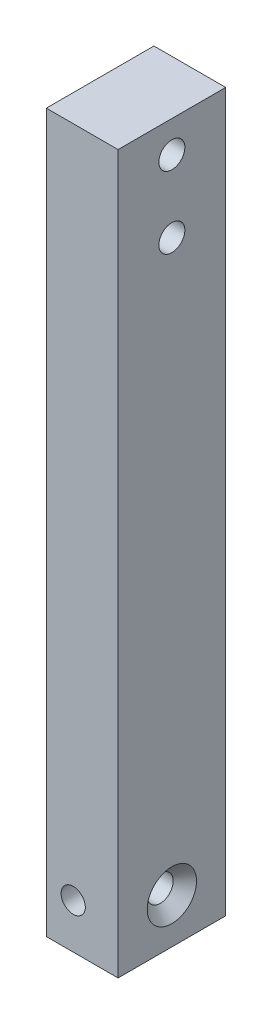
ISO-10303-21;
HEADER;
FILE_DESCRIPTION(('STEP AP214'),'2;1');
FILE_NAME('part.step','',(''),(''),'','','');
FILE_SCHEMA(('AUTOMOTIVE_DESIGN { 1 0 10303 214 1 1 1 1 }'));
ENDSEC;
DATA;
#1=APPLICATION_CONTEXT('core data for automotive mechanical design processes');
#2=APPLICATION_PROTOCOL_DEFINITION('international standard','automotive_design',2000,#1);
#3=PRODUCT_CONTEXT('',#1,'mechanical');
#4=PRODUCT('Part','Part','',(#3));
#5=PRODUCT_RELATED_PRODUCT_CATEGORY('part','',(#4));
#6=PRODUCT_DEFINITION_FORMATION('','',#4);
#7=PRODUCT_DEFINITION_CONTEXT('part definition',#1,'design');
#8=PRODUCT_DEFINITION('design','',#6,#7);
#9=PRODUCT_DEFINITION_SHAPE('','',#8);
#10=(LENGTH_UNIT() NAMED_UNIT(*) SI_UNIT(.MILLI.,.METRE.));
#11=(NAMED_UNIT(*) PLANE_ANGLE_UNIT() SI_UNIT($,.RADIAN.));
#12=(NAMED_UNIT(*) SI_UNIT($,.STERADIAN.) SOLID_ANGLE_UNIT());
#13=UNCERTAINTY_MEASURE_WITH_UNIT(LENGTH_MEASURE(1.E-05),#10,'distance_accuracy_value','');
#14=(GEOMETRIC_REPRESENTATION_CONTEXT(3) GLOBAL_UNCERTAINTY_ASSIGNED_CONTEXT((#13)) GLOBAL_UNIT_ASSIGNED_CONTEXT((#10,
#11,#12)) REPRESENTATION_CONTEXT('',''));
#15=CARTESIAN_POINT('',(0.,0.,0.));
#16=DIRECTION('',(0.,0.,1.));
#17=DIRECTION('',(1.,0.,0.));
#18=AXIS2_PLACEMENT_3D('',#15,#16,#17);
#19=CARTESIAN_POINT('',(8.,-40.,-6.));
#20=DIRECTION('',(0.,0.,1.));
#21=DIRECTION('',(1.,0.,0.));
#22=AXIS2_PLACEMENT_3D('',#19,#20,#21);
#23=PLANE('',#22);
#24=DIRECTION('',(0.,1.,0.));
#25=VECTOR('',#24,1.);
#26=CARTESIAN_POINT('',(0.,-40.,-6.));
#27=LINE('',#26,#25);
#28=CARTESIAN_POINT('',(0.,-40.,-6.));
#29=VERTEX_POINT('',#28);
#30=CARTESIAN_POINT('',(0.,40.,-6.));
#31=VERTEX_POINT('',#30);
#32=EDGE_CURVE('E102',#29,#31,#27,.T.);
#33=ORIENTED_EDGE('',*,*,#32,.T.);
#34=DIRECTION('',(-1.,0.,0.));
#35=VECTOR('',#34,1.);
#36=CARTESIAN_POINT('',(8.,40.,-6.));
#37=LINE('',#36,#35);
#38=CARTESIAN_POINT('',(8.,40.,-6.));
#39=VERTEX_POINT('',#38);
#40=EDGE_CURVE('E11',#39,#31,#37,.T.);
#41=ORIENTED_EDGE('',*,*,#40,.F.);
#42=DIRECTION('',(0.,1.,0.));
#43=VECTOR('',#42,1.);
#44=CARTESIAN_POINT('',(8.,-40.,-6.));
#45=LINE('',#44,#43);
#46=CARTESIAN_POINT('',(8.,-40.,-6.));
#47=VERTEX_POINT('',#46);
#48=EDGE_CURVE('E89',#47,#39,#45,.T.);
#49=ORIENTED_EDGE('',*,*,#48,.F.);
#50=DIRECTION('',(-1.,0.,0.));
#51=VECTOR('',#50,1.);
#52=CARTESIAN_POINT('',(8.,-40.,-6.));
#53=LINE('',#52,#51);
#54=EDGE_CURVE('E98',#47,#29,#53,.T.);
#55=ORIENTED_EDGE('',*,*,#54,.T.);
#56=EDGE_LOOP('',(#33,#41,#49,#55));
#57=FACE_BOUND('',#56,.T.);
#58=CARTESIAN_POINT('',(3.,-35.,-6.));
#59=DIRECTION('',(0.,0.,-1.));
#60=DIRECTION('',(-1.,0.,0.));
#61=AXIS2_PLACEMENT_3D('',#58,#59,#60);
#62=CIRCLE('',#61,1.35);
#63=CARTESIAN_POINT('',(1.65,-35.,-6.));
#64=VERTEX_POINT('',#63);
#65=EDGE_CURVE('E174',#64,#64,#62,.T.);
#66=ORIENTED_EDGE('',*,*,#65,.F.);
#67=EDGE_LOOP('',(#66));
#68=FACE_BOUND('',#67,.T.);
#69=ADVANCED_FACE('F37',(#57,#68),#23,.F.);
#70=CARTESIAN_POINT('',(8.,40.,6.));
#71=DIRECTION('',(0.,-1.,0.));
#72=DIRECTION('',(0.,0.,-1.));
#73=AXIS2_PLACEMENT_3D('',#70,#71,#72);
#74=PLANE('',#73);
#75=DIRECTION('',(0.,0.,1.));
#76=VECTOR('',#75,1.);
#77=CARTESIAN_POINT('',(0.,40.,6.));
#78=LINE('',#77,#76);
#79=CARTESIAN_POINT('',(0.,40.,6.));
#80=VERTEX_POINT('',#79);
#81=EDGE_CURVE('E93',#31,#80,#78,.T.);
#82=ORIENTED_EDGE('',*,*,#81,.T.);
#83=DIRECTION('',(-1.,0.,0.));
#84=VECTOR('',#83,1.);
#85=CARTESIAN_POINT('',(8.,40.,6.));
#86=LINE('',#85,#84);
#87=CARTESIAN_POINT('',(8.,40.,6.));
#88=VERTEX_POINT('',#87);
#89=EDGE_CURVE('E46',#88,#80,#86,.T.);
#90=ORIENTED_EDGE('',*,*,#89,.F.);
#91=DIRECTION('',(0.,0.,1.));
#92=VECTOR('',#91,1.);
#93=CARTESIAN_POINT('',(8.,40.,6.));
#94=LINE('',#93,#92);
#95=EDGE_CURVE('E84',#39,#88,#94,.T.);
#96=ORIENTED_EDGE('',*,*,#95,.F.);
#97=ORIENTED_EDGE('',*,*,#40,.T.);
#98=EDGE_LOOP('',(#82,#90,#96,#97));
#99=FACE_BOUND('',#98,.T.);
#100=ADVANCED_FACE('F92',(#99),#74,.F.);
#101=CARTESIAN_POINT('',(8.,-40.,6.));
#102=DIRECTION('',(0.,0.,-1.));
#103=DIRECTION('',(-1.,0.,0.));
#104=AXIS2_PLACEMENT_3D('',#101,#102,#103);
#105=PLANE('',#104);
#106=CARTESIAN_POINT('',(3.,-35.,6.));
#107=DIRECTION('',(0.,0.,1.));
#108=DIRECTION('',(1.,0.,0.));
#109=AXIS2_PLACEMENT_3D('',#106,#107,#108);
#110=CIRCLE('',#109,1.35);
#111=CARTESIAN_POINT('',(4.35,-35.,6.));
#112=VERTEX_POINT('',#111);
#113=EDGE_CURVE('E153',#112,#112,#110,.T.);
#114=ORIENTED_EDGE('',*,*,#113,.F.);
#115=EDGE_LOOP('',(#114));
#116=FACE_BOUND('',#115,.T.);
#117=DIRECTION('',(0.,-1.,0.));
#118=VECTOR('',#117,1.);
#119=CARTESIAN_POINT('',(0.,-40.,6.));
#120=LINE('',#119,#118);
#121=CARTESIAN_POINT('',(0.,-40.,6.));
#122=VERTEX_POINT('',#121);
#123=EDGE_CURVE('E71',#80,#122,#120,.T.);
#124=ORIENTED_EDGE('',*,*,#123,.T.);
#125=DIRECTION('',(-1.,0.,0.));
#126=VECTOR('',#125,1.);
#127=CARTESIAN_POINT('',(8.,-40.,6.));
#128=LINE('',#127,#126);
#129=CARTESIAN_POINT('',(8.,-40.,6.));
#130=VERTEX_POINT('',#129);
#131=EDGE_CURVE('E94',#130,#122,#128,.T.);
#132=ORIENTED_EDGE('',*,*,#131,.F.);
#133=DIRECTION('',(0.,-1.,0.));
#134=VECTOR('',#133,1.);
#135=CARTESIAN_POINT('',(8.,-40.,6.));
#136=LINE('',#135,#134);
#137=EDGE_CURVE('E87',#88,#130,#136,.T.);
#138=ORIENTED_EDGE('',*,*,#137,.F.);
#139=ORIENTED_EDGE('',*,*,#89,.T.);
#140=EDGE_LOOP('',(#124,#132,#138,#139));
#141=FACE_BOUND('',#140,.T.);
#142=ADVANCED_FACE('F96',(#116,#141),#105,.F.);
#143=CARTESIAN_POINT('',(8.,-40.,6.));
#144=DIRECTION('',(0.,1.,0.));
#145=DIRECTION('',(0.,0.,1.));
#146=AXIS2_PLACEMENT_3D('',#143,#144,#145);
#147=PLANE('',#146);
#148=DIRECTION('',(0.,0.,-1.));
#149=VECTOR('',#148,1.);
#150=CARTESIAN_POINT('',(0.,-40.,6.));
#151=LINE('',#150,#149);
#152=EDGE_CURVE('E77',#122,#29,#151,.T.);
#153=ORIENTED_EDGE('',*,*,#152,.T.);
#154=ORIENTED_EDGE('',*,*,#54,.F.);
#155=DIRECTION('',(0.,0.,-1.));
#156=VECTOR('',#155,1.);
#157=CARTESIAN_POINT('',(8.,-40.,6.));
#158=LINE('',#157,#156);
#159=EDGE_CURVE('E54',#130,#47,#158,.T.);
#160=ORIENTED_EDGE('',*,*,#159,.F.);
#161=ORIENTED_EDGE('',*,*,#131,.T.);
#162=EDGE_LOOP('',(#153,#154,#160,#161));
#163=FACE_BOUND('',#162,.T.);
#164=ADVANCED_FACE('F110',(#163),#147,.F.);
#165=CARTESIAN_POINT('',(8.,0.,0.));
#166=DIRECTION('',(-1.,0.,0.));
#167=DIRECTION('',(0.,0.,1.));
#168=AXIS2_PLACEMENT_3D('',#165,#166,#167);
#169=PLANE('',#168);
#170=CARTESIAN_POINT('',(8.,36.5,0.));
#171=DIRECTION('',(-1.,0.,0.));
#172=DIRECTION('',(0.,0.,1.));
#173=AXIS2_PLACEMENT_3D('',#170,#171,#172);
#174=CIRCLE('',#173,1.45);
#175=CARTESIAN_POINT('',(8.,36.5,1.45));
#176=VERTEX_POINT('',#175);
#177=EDGE_CURVE('E137',#176,#176,#174,.T.);
#178=ORIENTED_EDGE('',*,*,#177,.T.);
#179=EDGE_LOOP('',(#178));
#180=FACE_BOUND('',#179,.T.);
#181=CARTESIAN_POINT('',(8.,28.5,0.));
#182=DIRECTION('',(-1.,0.,0.));
#183=DIRECTION('',(0.,0.,1.));
#184=AXIS2_PLACEMENT_3D('',#181,#182,#183);
#185=CIRCLE('',#184,1.45);
#186=CARTESIAN_POINT('',(8.,28.5,1.45));
#187=VERTEX_POINT('',#186);
#188=EDGE_CURVE('E128',#187,#187,#185,.T.);
#189=ORIENTED_EDGE('',*,*,#188,.T.);
#190=EDGE_LOOP('',(#189));
#191=FACE_BOUND('',#190,.T.);
#192=CARTESIAN_POINT('',(8.,-35.,0.));
#193=DIRECTION('',(1.,0.,0.));
#194=DIRECTION('',(0.,0.,-1.));
#195=AXIS2_PLACEMENT_3D('',#192,#193,#194);
#196=CIRCLE('',#195,2.75);
#197=CARTESIAN_POINT('',(8.,-35.,-2.75));
#198=VERTEX_POINT('',#197);
#199=EDGE_CURVE('E125',#198,#198,#196,.T.);
#200=ORIENTED_EDGE('',*,*,#199,.F.);
#201=EDGE_LOOP('',(#200));
#202=FACE_BOUND('',#201,.T.);
#203=ORIENTED_EDGE('',*,*,#48,.T.);
#204=ORIENTED_EDGE('',*,*,#95,.T.);
#205=ORIENTED_EDGE('',*,*,#137,.T.);
#206=ORIENTED_EDGE('',*,*,#159,.T.);
#207=EDGE_LOOP('',(#203,#204,#205,#206));
#208=FACE_BOUND('',#207,.T.);
#209=ADVANCED_FACE('F85',(#180,#191,#202,#208),#169,.F.);
#210=CARTESIAN_POINT('',(0.,0.,0.));
#211=DIRECTION('',(-1.,0.,0.));
#212=DIRECTION('',(0.,0.,1.));
#213=AXIS2_PLACEMENT_3D('',#210,#211,#212);
#214=PLANE('',#213);
#215=CARTESIAN_POINT('',(0.,36.5,0.));
#216=DIRECTION('',(-1.,0.,0.));
#217=DIRECTION('',(0.,0.,1.));
#218=AXIS2_PLACEMENT_3D('',#215,#216,#217);
#219=CIRCLE('',#218,2.75);
#220=CARTESIAN_POINT('',(0.,36.5,2.75));
#221=VERTEX_POINT('',#220);
#222=EDGE_CURVE('E143',#221,#221,#219,.T.);
#223=ORIENTED_EDGE('',*,*,#222,.F.);
#224=EDGE_LOOP('',(#223));
#225=FACE_BOUND('',#224,.T.);
#226=CARTESIAN_POINT('',(0.,28.5,0.));
#227=DIRECTION('',(-1.,0.,0.));
#228=DIRECTION('',(0.,0.,1.));
#229=AXIS2_PLACEMENT_3D('',#226,#227,#228);
#230=CIRCLE('',#229,2.75);
#231=CARTESIAN_POINT('',(0.,28.5,2.75));
#232=VERTEX_POINT('',#231);
#233=EDGE_CURVE('E134',#232,#232,#230,.T.);
#234=ORIENTED_EDGE('',*,*,#233,.F.);
#235=EDGE_LOOP('',(#234));
#236=FACE_BOUND('',#235,.T.);
#237=CARTESIAN_POINT('',(0.,-35.,0.));
#238=DIRECTION('',(-1.,0.,0.));
#239=DIRECTION('',(0.,0.,1.));
#240=AXIS2_PLACEMENT_3D('',#237,#238,#239);
#241=CIRCLE('',#240,3.);
#242=CARTESIAN_POINT('',(0.,-35.,3.));
#243=VERTEX_POINT('',#242);
#244=EDGE_CURVE('E117',#243,#243,#241,.T.);
#245=ORIENTED_EDGE('',*,*,#244,.F.);
#246=EDGE_LOOP('',(#245));
#247=FACE_BOUND('',#246,.T.);
#248=ORIENTED_EDGE('',*,*,#32,.F.);
#249=ORIENTED_EDGE('',*,*,#152,.F.);
#250=ORIENTED_EDGE('',*,*,#123,.F.);
#251=ORIENTED_EDGE('',*,*,#81,.F.);
#252=EDGE_LOOP('',(#248,#249,#250,#251));
#253=FACE_BOUND('',#252,.T.);
#254=ADVANCED_FACE('F113',(#225,#236,#247,#253),#214,.T.);
#255=CARTESIAN_POINT('',(5.,-35.,0.));
#256=DIRECTION('',(-1.,0.,0.));
#257=DIRECTION('',(0.,0.,1.));
#258=AXIS2_PLACEMENT_3D('',#255,#256,#257);
#259=CYLINDRICAL_SURFACE('',#258,3.);
#260=CARTESIAN_POINT('',(1.65,-35.,-3.));
#261=CARTESIAN_POINT('',(1.65000350950048,-35.0717942983233,-2.99999710819746));
#262=CARTESIAN_POINT('',(1.6557608673864,-35.1436983257465,-2.99739409084056));
#263=CARTESIAN_POINT('',(1.67855970174929,-35.2854324900246,-2.98724013750941));
#264=CARTESIAN_POINT('',(1.69562778351864,-35.3552573305551,-2.97967753594657));
#265=CARTESIAN_POINT('',(1.74027495751617,-35.4905590338216,-2.96040619544781));
#266=CARTESIAN_POINT('',(1.76781618593373,-35.5560505730756,-2.94871240278778));
#267=CARTESIAN_POINT('',(1.83245621750942,-35.6814095112711,-2.92229198635354));
#268=CARTESIAN_POINT('',(1.86955298622526,-35.74127810368,-2.90756600828684));
#269=CARTESIAN_POINT('',(1.9544578498576,-35.8571850017538,-2.87559272931306));
#270=CARTESIAN_POINT('',(2.002721084672,-35.9128645010314,-2.85825436147132));
#271=CARTESIAN_POINT('',(2.10762143877568,-36.0156568565076,-2.8233655994703));
#272=CARTESIAN_POINT('',(2.16426363743658,-36.0627644774873,-2.80581508267312));
#273=CARTESIAN_POINT('',(2.28838727675673,-36.1498651080576,-2.77130585686826));
#274=CARTESIAN_POINT('',(2.35631334295036,-36.1892673477779,-2.75444463646883));
#275=CARTESIAN_POINT('',(2.4986888749684,-36.2559279592838,-2.72469944797672));
#276=CARTESIAN_POINT('',(2.57313441083328,-36.283193587576,-2.71181310471531));
#277=CARTESIAN_POINT('',(2.72231593088279,-36.3232653242064,-2.69247896324617));
#278=CARTESIAN_POINT('',(2.79682369484703,-36.3367664156076,-2.68572383239535));
#279=CARTESIAN_POINT('',(2.94732924033773,-36.3510844529698,-2.67855223230496));
#280=CARTESIAN_POINT('',(3.0233259509632,-36.3519102027218,-2.67813136354141));
#281=CARTESIAN_POINT('',(3.16714916508567,-36.3413714850933,-2.6834202803121));
#282=CARTESIAN_POINT('',(3.23508267403706,-36.3311244545175,-2.68856813661516));
#283=CARTESIAN_POINT('',(3.36813718586633,-36.3006289156747,-2.7034513561071));
#284=CARTESIAN_POINT('',(3.4332575316965,-36.2803780844885,-2.71318778475506));
#285=CARTESIAN_POINT('',(3.56060319923034,-36.2300488379592,-2.73637704262371));
#286=CARTESIAN_POINT('',(3.62272965899791,-36.1997583977564,-2.74990898685239));
#287=CARTESIAN_POINT('',(3.7412844568565,-36.1303629500304,-2.77915372781559));
#288=CARTESIAN_POINT('',(3.79771035541585,-36.0912541916881,-2.79486745146097));
#289=CARTESIAN_POINT('',(3.90921040456463,-36.0007467888471,-2.82861476581816));
#290=CARTESIAN_POINT('',(3.96358342883758,-35.9485096459322,-2.84672309557187));
#291=CARTESIAN_POINT('',(4.06305500229032,-35.8355129633098,-2.88191228554332));
#292=CARTESIAN_POINT('',(4.10815060725115,-35.774750728395,-2.89899281837343));
#293=CARTESIAN_POINT('',(4.18905826521189,-35.6439940036119,-2.9308585664278));
#294=CARTESIAN_POINT('',(4.22453943934769,-35.5737718186378,-2.94555628131278));
#295=CARTESIAN_POINT('',(4.28293078287295,-35.427523890627,-2.9703043427381));
#296=CARTESIAN_POINT('',(4.30584907824224,-35.351501935367,-2.98035769270489));
#297=CARTESIAN_POINT('',(4.33689120397102,-35.2016305566774,-2.99409415860333));
#298=CARTESIAN_POINT('',(4.34595306619363,-35.1280124752407,-2.99818023391338));
#299=CARTESIAN_POINT('',(4.35187762426023,-34.9801982870243,-3.00084388971438));
#300=CARTESIAN_POINT('',(4.34874460445536,-34.9060023923851,-2.99942340479119));
#301=CARTESIAN_POINT('',(4.33099648303478,-34.7638361617384,-2.99148733912252));
#302=CARTESIAN_POINT('',(4.31708032703026,-34.6957591141238,-2.98528201918371));
#303=CARTESIAN_POINT('',(4.2791801221918,-34.5630042972543,-2.96875596530774));
#304=CARTESIAN_POINT('',(4.25519486073181,-34.498326938481,-2.95843473569758));
#305=CARTESIAN_POINT('',(4.19708127230387,-34.371918029331,-2.93424357362228));
#306=CARTESIAN_POINT('',(4.16266054545513,-34.3103407704961,-2.92027320912254));
#307=CARTESIAN_POINT('',(4.08497169467193,-34.1936146722566,-2.89022166549104));
#308=CARTESIAN_POINT('',(4.04169970073611,-34.1384686613751,-2.87413956415872));
#309=CARTESIAN_POINT('',(3.9433857999954,-34.0313760119846,-2.83992652839844));
#310=CARTESIAN_POINT('',(3.88766779977351,-33.9800675863835,-2.82173597139228));
#311=CARTESIAN_POINT('',(3.7682036616592,-33.8873073399625,-2.7864643019524));
#312=CARTESIAN_POINT('',(3.70445445882444,-33.84585929969,-2.76938361687061));
#313=CARTESIAN_POINT('',(3.56855280366971,-33.7730787365895,-2.73793380812811));
#314=CARTESIAN_POINT('',(3.49622705097992,-33.7420322293053,-2.72364526364248));
#315=CARTESIAN_POINT('',(3.34652017216282,-33.6928601422859,-2.70039592602716));
#316=CARTESIAN_POINT('',(3.26914424141069,-33.6747215053532,-2.69142975048318));
#317=CARTESIAN_POINT('',(3.11871155273221,-33.653272826041,-2.68075667169167));
#318=CARTESIAN_POINT('',(3.04585733377422,-33.6488194478458,-2.6784906959906));
#319=CARTESIAN_POINT('',(2.90045361080538,-33.6517144036473,-2.67994960996189));
#320=CARTESIAN_POINT('',(2.82790404104926,-33.6590600445854,-2.68367313256576));
#321=CARTESIAN_POINT('',(2.68993930670592,-33.6843359276107,-2.69614629806841));
#322=CARTESIAN_POINT('',(2.62436300219797,-33.7015680292289,-2.70456348750257));
#323=CARTESIAN_POINT('',(2.49704581857155,-33.7453793779933,-2.7251623303891));
#324=CARTESIAN_POINT('',(2.43530606168956,-33.7719613450848,-2.73734507914543));
#325=CARTESIAN_POINT('',(2.31303445083683,-33.8356826269182,-2.7650759189415));
#326=CARTESIAN_POINT('',(2.25283933099918,-33.8733938317262,-2.78079077572679));
#327=CARTESIAN_POINT('',(2.13927723198342,-33.9575716235044,-2.81342848547022));
#328=CARTESIAN_POINT('',(2.08591321078676,-34.0040419819468,-2.83035185682753));
#329=CARTESIAN_POINT('',(1.98253042634256,-34.1093922141672,-2.86533877617132));
#330=CARTESIAN_POINT('',(1.93325276629208,-34.1690149420683,-2.88336671225994));
#331=CARTESIAN_POINT('',(1.84531523408091,-34.2963059813491,-2.91704362931292));
#332=CARTESIAN_POINT('',(1.80666024541196,-34.3639779727494,-2.93269151464089));
#333=CARTESIAN_POINT('',(1.74166835741715,-34.5049570709397,-2.95973519982059));
#334=CARTESIAN_POINT('',(1.71521243882989,-34.5782012385757,-2.97117185469687));
#335=CARTESIAN_POINT('',(1.67528215179476,-34.728630894621,-2.98865352259014));
#336=CARTESIAN_POINT('',(1.66176841341891,-34.8058036730128,-2.99471488298502));
#337=CARTESIAN_POINT('',(1.65335528527319,-34.902898747277,-2.99849167271413));
#338=CARTESIAN_POINT('',(1.65209827142417,-34.9222909880002,-2.99905628756061));
#339=CARTESIAN_POINT('',(1.6504201478228,-34.9611194691812,-2.99981084536562));
#340=CARTESIAN_POINT('',(1.64999904951026,-34.9805557102375,-3.00000078319655));
#341=CARTESIAN_POINT('',(1.65,-35.,-3.));
#342=B_SPLINE_CURVE_WITH_KNOTS('',3,(#260,#261,#262,#263,#264,#265,#266,#267,#268,#269,#270,
#271,#272,#273,#274,#275,#276,#277,#278,#279,#280,#281,#282,#283,#284,#285,#286,#287,#288,#289,
#290,#291,#292,#293,#294,#295,#296,#297,#298,#299,#300,#301,#302,#303,#304,#305,#306,#307,#308,
#309,#310,#311,#312,#313,#314,#315,#316,#317,#318,#319,#320,#321,#322,#323,#324,#325,#326,#327,
#328,#329,#330,#331,#332,#333,#334,#335,#336,#337,#338,#339,#340,#341),.UNSPECIFIED.,.T.,.F.,(4,
2,2,2,2,2,2,2,2,2,2,2,2,2,2,2,2,2,2,2,2,2,2,2,2,2,2,2,2,2,2,2,2,2,2,2,2,2,2,2,4),(0.,
0.215303084427217,0.431114414931766,0.646152823408292,0.86114548647053,1.08726953424048,
1.31353122563331,1.55326754039452,1.79286032311304,2.01964651955436,2.24627519213992,
2.45199894249931,2.65777048513474,2.86819857827373,3.07871634515167,3.31031406768875,
3.54198517551711,3.78083332859653,4.0195268059487,4.24120773308937,4.46281078549604,
4.67114116806695,4.87949664714234,5.09433557821699,5.30926864394808,5.54191493070125,
5.77465027258589,6.01334164055913,6.25179121126565,6.46968869048817,6.68753644292214,
6.8916189909066,7.09576095718724,7.3131138968391,7.53056063789665,7.76770791551891,
8.00496403362731,8.23985367573744,8.47402649574548,8.5323369516829,8.59064820561441),.UNSPECIFIED.);
#343=CARTESIAN_POINT('',(1.65,-35.,-3.));
#344=VERTEX_POINT('',#343);
#345=EDGE_CURVE('E170',#344,#344,#342,.T.);
#346=ORIENTED_EDGE('',*,*,#345,.F.);
#347=EDGE_LOOP('',(#346));
#348=FACE_BOUND('',#347,.T.);
#349=CARTESIAN_POINT('',(4.35,-35.,3.));
#350=CARTESIAN_POINT('',(4.34999649049952,-34.9282057016768,2.99999710819746));
#351=CARTESIAN_POINT('',(4.3442391326136,-34.8563016742536,2.99739409084056));
#352=CARTESIAN_POINT('',(4.3214402982507,-34.7145675099754,2.98724013750941));
#353=CARTESIAN_POINT('',(4.30437221648136,-34.6447426694449,2.97967753594657));
#354=CARTESIAN_POINT('',(4.25972504248383,-34.5094409661784,2.96040619544782));
#355=CARTESIAN_POINT('',(4.23218381406627,-34.4439494269245,2.94871240278778));
#356=CARTESIAN_POINT('',(4.16754378249057,-34.3185904887289,2.92229198635354));
#357=CARTESIAN_POINT('',(4.13044701377473,-34.2587218963201,2.90756600828684));
#358=CARTESIAN_POINT('',(4.04554215014239,-34.1428149982462,2.87559272931306));
#359=CARTESIAN_POINT('',(3.99727891532799,-34.0871354989686,2.85825436147132));
#360=CARTESIAN_POINT('',(3.89237856122431,-33.9843431434924,2.8233655994703));
#361=CARTESIAN_POINT('',(3.83573636256342,-33.9372355225128,2.80581508267313));
#362=CARTESIAN_POINT('',(3.71161272324326,-33.8501348919425,2.77130585686827));
#363=CARTESIAN_POINT('',(3.64368665704964,-33.8107326522221,2.75444463646883));
#364=CARTESIAN_POINT('',(3.50131112503159,-33.7440720407162,2.72469944797673));
#365=CARTESIAN_POINT('',(3.42686558916672,-33.716806412424,2.71181310471532));
#366=CARTESIAN_POINT('',(3.2776840691172,-33.6767346757936,2.69247896324618));
#367=CARTESIAN_POINT('',(3.20317630515297,-33.6632335843924,2.68572383239536));
#368=CARTESIAN_POINT('',(3.05267075966227,-33.6489155470303,2.67855223230496));
#369=CARTESIAN_POINT('',(2.9766740490368,-33.6480897972783,2.67813136354142));
#370=CARTESIAN_POINT('',(2.83285083491432,-33.6586285149067,2.68342028031211));
#371=CARTESIAN_POINT('',(2.76491732596293,-33.6688755454825,2.68856813661517));
#372=CARTESIAN_POINT('',(2.63186281413367,-33.6993710843254,2.70345135610711));
#373=CARTESIAN_POINT('',(2.56674246830349,-33.7196219155115,2.71318778475507));
#374=CARTESIAN_POINT('',(2.43939680076965,-33.7699511620408,2.73637704262371));
#375=CARTESIAN_POINT('',(2.37727034100209,-33.8002416022436,2.7499089868524));
#376=CARTESIAN_POINT('',(2.25871554314349,-33.8696370499697,2.7791537278156));
#377=CARTESIAN_POINT('',(2.20228964458414,-33.9087458083119,2.79486745146098));
#378=CARTESIAN_POINT('',(2.09078959543536,-33.9992532111529,2.82861476581816));
#379=CARTESIAN_POINT('',(2.03641657116241,-34.0514903540679,2.84672309557188));
#380=CARTESIAN_POINT('',(1.93694499770968,-34.1644870366902,2.88191228554333));
#381=CARTESIAN_POINT('',(1.89184939274885,-34.225249271605,2.89899281837343));
#382=CARTESIAN_POINT('',(1.81094173478811,-34.3560059963881,2.93085856642781));
#383=CARTESIAN_POINT('',(1.7754605606523,-34.4262281813622,2.94555628131279));
#384=CARTESIAN_POINT('',(1.71706921712705,-34.572476109373,2.97030434273811));
#385=CARTESIAN_POINT('',(1.69415092175776,-34.648498064633,2.98035769270489));
#386=CARTESIAN_POINT('',(1.66310879602898,-34.7983694433227,2.99409415860334));
#387=CARTESIAN_POINT('',(1.65404693380637,-34.8719875247594,2.99818023391339));
#388=CARTESIAN_POINT('',(1.64812237573977,-35.0198017129758,3.00084388971438));
#389=CARTESIAN_POINT('',(1.65125539554464,-35.0939976076149,2.99942340479119));
#390=CARTESIAN_POINT('',(1.66900351696522,-35.2361638382616,2.99148733912252));
#391=CARTESIAN_POINT('',(1.68291967296974,-35.3042408858762,2.98528201918371));
#392=CARTESIAN_POINT('',(1.7208198778082,-35.4369957027458,2.96875596530774));
#393=CARTESIAN_POINT('',(1.74480513926819,-35.501673061519,2.95843473569757));
#394=CARTESIAN_POINT('',(1.80291872769613,-35.628081970669,2.93424357362228));
#395=CARTESIAN_POINT('',(1.83733945454487,-35.6896592295039,2.92027320912254));
#396=CARTESIAN_POINT('',(1.91502830532807,-35.8063853277435,2.89022166549104));
#397=CARTESIAN_POINT('',(1.95830029926389,-35.861531338625,2.87413956415871));
#398=CARTESIAN_POINT('',(2.05661420000461,-35.9686239880154,2.83992652839843));
#399=CARTESIAN_POINT('',(2.11233220022649,-36.0199324136165,2.82173597139227));
#400=CARTESIAN_POINT('',(2.23179633834081,-36.1126926600375,2.78646430195239));
#401=CARTESIAN_POINT('',(2.29554554117557,-36.15414070031,2.7693836168706));
#402=CARTESIAN_POINT('',(2.4314471963303,-36.2269212634106,2.7379338081281));
#403=CARTESIAN_POINT('',(2.50377294902009,-36.2579677706947,2.72364526364247));
#404=CARTESIAN_POINT('',(2.65347982783719,-36.3071398577141,2.70039592602715));
#405=CARTESIAN_POINT('',(2.73085575858932,-36.3252784946468,2.69142975048318));
#406=CARTESIAN_POINT('',(2.8812884472678,-36.346727173959,2.68075667169167));
#407=CARTESIAN_POINT('',(2.95414266622579,-36.3511805521543,2.67849069599059));
#408=CARTESIAN_POINT('',(3.09954638919463,-36.3482855963527,2.67994960996188));
#409=CARTESIAN_POINT('',(3.17209595895075,-36.3409399554146,2.68367313256576));
#410=CARTESIAN_POINT('',(3.31006069329408,-36.3156640723893,2.6961462980684));
#411=CARTESIAN_POINT('',(3.37563699780203,-36.2984319707712,2.70456348750257));
#412=CARTESIAN_POINT('',(3.50295418142846,-36.2546206220068,2.72516233038909));
#413=CARTESIAN_POINT('',(3.56469393831045,-36.2280386549153,2.73734507914542));
#414=CARTESIAN_POINT('',(3.68696554916317,-36.1643173730818,2.76507591894149));
#415=CARTESIAN_POINT('',(3.74716066900083,-36.1266061682739,2.78079077572678));
#416=CARTESIAN_POINT('',(3.86072276801659,-36.0424283764956,2.81342848547021));
#417=CARTESIAN_POINT('',(3.91408678921325,-35.9959580180532,2.83035185682753));
#418=CARTESIAN_POINT('',(4.01746957365745,-35.8906077858328,2.86533877617131));
#419=CARTESIAN_POINT('',(4.06674723370793,-35.8309850579317,2.88336671225994));
#420=CARTESIAN_POINT('',(4.15468476591909,-35.7036940186509,2.91704362931292));
#421=CARTESIAN_POINT('',(4.19333975458804,-35.6360220272506,2.93269151464089));
#422=CARTESIAN_POINT('',(4.25833164258285,-35.4950429290604,2.95973519982059));
#423=CARTESIAN_POINT('',(4.28478756117011,-35.4217987614243,2.97117185469687));
#424=CARTESIAN_POINT('',(4.32471784820524,-35.271369105379,2.98865352259014));
#425=CARTESIAN_POINT('',(4.33823158658109,-35.1941963269872,2.99471488298502));
#426=CARTESIAN_POINT('',(4.34664471472681,-35.097101252723,2.99849167271413));
#427=CARTESIAN_POINT('',(4.34790172857583,-35.0777090119998,2.99905628756061));
#428=CARTESIAN_POINT('',(4.3495798521772,-35.0388805308188,2.99981084536562));
#429=CARTESIAN_POINT('',(4.35000095048974,-35.0194442897625,3.00000078319655));
#430=CARTESIAN_POINT('',(4.35,-35.,3.));
#431=B_SPLINE_CURVE_WITH_KNOTS('',3,(#349,#350,#351,#352,#353,#354,#355,#356,#357,#358,#359,
#360,#361,#362,#363,#364,#365,#366,#367,#368,#369,#370,#371,#372,#373,#374,#375,#376,#377,#378,
#379,#380,#381,#382,#383,#384,#385,#386,#387,#388,#389,#390,#391,#392,#393,#394,#395,#396,#397,
#398,#399,#400,#401,#402,#403,#404,#405,#406,#407,#408,#409,#410,#411,#412,#413,#414,#415,#416,
#417,#418,#419,#420,#421,#422,#423,#424,#425,#426,#427,#428,#429,#430),.UNSPECIFIED.,.T.,.F.,(4,
2,2,2,2,2,2,2,2,2,2,2,2,2,2,2,2,2,2,2,2,2,2,2,2,2,2,2,2,2,2,2,2,2,2,2,2,2,2,2,4),(0.,
0.215303084427217,0.431114414931766,0.646152823408293,0.861145486470532,1.08726953424048,
1.31353122563331,1.55326754039452,1.79286032311303,2.01964651955436,2.24627519213992,
2.45199894249931,2.65777048513474,2.86819857827373,3.07871634515167,3.31031406768874,
3.54198517551711,3.78083332859654,4.01952680594871,4.24120773308938,4.46281078549604,
4.67114116806694,4.87949664714234,5.09433557821699,5.30926864394808,5.54191493070125,
5.7746502725859,6.01334164055913,6.25179121126565,6.46968869048818,6.68753644292214,
6.8916189909066,7.09576095718724,7.3131138968391,7.53056063789665,7.7677079155189,
8.0049640336273,8.23985367573744,8.47402649574548,8.5323369516829,8.59064820561441),.UNSPECIFIED.);
#432=CARTESIAN_POINT('',(4.35,-35.,3.));
#433=VERTEX_POINT('',#432);
#434=EDGE_CURVE('E146',#433,#433,#431,.T.);
#435=ORIENTED_EDGE('',*,*,#434,.T.);
#436=EDGE_LOOP('',(#435));
#437=FACE_BOUND('',#436,.T.);
#438=CARTESIAN_POINT('',(5.,-35.,0.));
#439=DIRECTION('',(-1.,0.,0.));
#440=DIRECTION('',(0.,0.,1.));
#441=AXIS2_PLACEMENT_3D('',#438,#439,#440);
#442=CIRCLE('',#441,3.);
#443=CARTESIAN_POINT('',(5.,-35.,3.));
#444=VERTEX_POINT('',#443);
#445=EDGE_CURVE('E105',#444,#444,#442,.T.);
#446=ORIENTED_EDGE('',*,*,#445,.F.);
#447=EDGE_LOOP('',(#446));
#448=FACE_BOUND('',#447,.T.);
#449=ORIENTED_EDGE('',*,*,#244,.T.);
#450=EDGE_LOOP('',(#449));
#451=FACE_BOUND('',#450,.T.);
#452=ADVANCED_FACE('F192',(#348,#437,#448,#451),#259,.F.);
#453=CARTESIAN_POINT('',(5.,-35.,0.));
#454=DIRECTION('',(-1.,0.,0.));
#455=DIRECTION('',(0.,0.,1.));
#456=AXIS2_PLACEMENT_3D('',#453,#454,#455);
#457=PLANE('',#456);
#458=CARTESIAN_POINT('',(5.,-35.,0.));
#459=DIRECTION('',(-1.,0.,0.));
#460=DIRECTION('',(0.,0.,1.));
#461=AXIS2_PLACEMENT_3D('',#458,#459,#460);
#462=CIRCLE('',#461,1.45);
#463=CARTESIAN_POINT('',(5.,-35.,1.45));
#464=VERTEX_POINT('',#463);
#465=EDGE_CURVE('E40',#464,#464,#462,.T.);
#466=ORIENTED_EDGE('',*,*,#465,.F.);
#467=EDGE_LOOP('',(#466));
#468=FACE_BOUND('',#467,.T.);
#469=ORIENTED_EDGE('',*,*,#445,.T.);
#470=EDGE_LOOP('',(#469));
#471=FACE_BOUND('',#470,.T.);
#472=ADVANCED_FACE('F199',(#468,#471),#457,.T.);
#473=CARTESIAN_POINT('',(8.,-35.,0.));
#474=DIRECTION('',(1.,0.,0.));
#475=DIRECTION('',(0.,0.,-1.));
#476=AXIS2_PLACEMENT_3D('',#473,#474,#475);
#477=CYLINDRICAL_SURFACE('',#476,1.45);
#478=ORIENTED_EDGE('',*,*,#465,.T.);
#479=EDGE_LOOP('',(#478));
#480=FACE_BOUND('',#479,.T.);
#481=CARTESIAN_POINT('',(6.7,-35.,0.));
#482=DIRECTION('',(1.,0.,0.));
#483=DIRECTION('',(0.,0.,-1.));
#484=AXIS2_PLACEMENT_3D('',#481,#482,#483);
#485=CIRCLE('',#484,1.45);
#486=CARTESIAN_POINT('',(6.7,-35.,-1.45));
#487=VERTEX_POINT('',#486);
#488=EDGE_CURVE('E122',#487,#487,#485,.T.);
#489=ORIENTED_EDGE('',*,*,#488,.T.);
#490=EDGE_LOOP('',(#489));
#491=FACE_BOUND('',#490,.T.);
#492=ADVANCED_FACE('F203',(#480,#491),#477,.F.);
#493=CARTESIAN_POINT('',(8.,-35.,0.));
#494=DIRECTION('',(1.,0.,0.));
#495=DIRECTION('',(0.,0.,-1.));
#496=AXIS2_PLACEMENT_3D('',#493,#494,#495);
#497=CONICAL_SURFACE('',#496,2.75,0.78539816339745);
#498=ORIENTED_EDGE('',*,*,#488,.F.);
#499=EDGE_LOOP('',(#498));
#500=FACE_BOUND('',#499,.T.);
#501=ORIENTED_EDGE('',*,*,#199,.T.);
#502=EDGE_LOOP('',(#501));
#503=FACE_BOUND('',#502,.T.);
#504=ADVANCED_FACE('F207',(#500,#503),#497,.F.);
#505=CARTESIAN_POINT('',(0.,28.5,0.));
#506=DIRECTION('',(-1.,0.,0.));
#507=DIRECTION('',(0.,0.,1.));
#508=AXIS2_PLACEMENT_3D('',#505,#506,#507);
#509=CYLINDRICAL_SURFACE('',#508,1.44999999999999);
#510=ORIENTED_EDGE('',*,*,#188,.F.);
#511=EDGE_LOOP('',(#510));
#512=FACE_BOUND('',#511,.T.);
#513=CARTESIAN_POINT('',(1.30000000000001,28.5,0.));
#514=DIRECTION('',(-1.,0.,0.));
#515=DIRECTION('',(0.,0.,1.));
#516=AXIS2_PLACEMENT_3D('',#513,#514,#515);
#517=CIRCLE('',#516,1.44999999999999);
#518=CARTESIAN_POINT('',(1.30000000000001,28.5,1.44999999999999));
#519=VERTEX_POINT('',#518);
#520=EDGE_CURVE('E131',#519,#519,#517,.T.);
#521=ORIENTED_EDGE('',*,*,#520,.T.);
#522=EDGE_LOOP('',(#521));
#523=FACE_BOUND('',#522,.T.);
#524=ADVANCED_FACE('F211',(#512,#523),#509,.F.);
#525=CARTESIAN_POINT('',(0.,28.5,0.));
#526=DIRECTION('',(-1.,0.,0.));
#527=DIRECTION('',(0.,0.,1.));
#528=AXIS2_PLACEMENT_3D('',#525,#526,#527);
#529=CONICAL_SURFACE('',#528,2.75,0.785398163397449);
#530=ORIENTED_EDGE('',*,*,#520,.F.);
#531=EDGE_LOOP('',(#530));
#532=FACE_BOUND('',#531,.T.);
#533=ORIENTED_EDGE('',*,*,#233,.T.);
#534=EDGE_LOOP('',(#533));
#535=FACE_BOUND('',#534,.T.);
#536=ADVANCED_FACE('F215',(#532,#535),#529,.F.);
#537=CARTESIAN_POINT('',(0.,36.5,0.));
#538=DIRECTION('',(-1.,0.,0.));
#539=DIRECTION('',(0.,0.,1.));
#540=AXIS2_PLACEMENT_3D('',#537,#538,#539);
#541=CYLINDRICAL_SURFACE('',#540,1.44999999999999);
#542=ORIENTED_EDGE('',*,*,#177,.F.);
#543=EDGE_LOOP('',(#542));
#544=FACE_BOUND('',#543,.T.);
#545=CARTESIAN_POINT('',(1.30000000000001,36.5,0.));
#546=DIRECTION('',(-1.,0.,0.));
#547=DIRECTION('',(0.,0.,1.));
#548=AXIS2_PLACEMENT_3D('',#545,#546,#547);
#549=CIRCLE('',#548,1.44999999999999);
#550=CARTESIAN_POINT('',(1.30000000000001,36.5,1.44999999999999));
#551=VERTEX_POINT('',#550);
#552=EDGE_CURVE('E140',#551,#551,#549,.T.);
#553=ORIENTED_EDGE('',*,*,#552,.T.);
#554=EDGE_LOOP('',(#553));
#555=FACE_BOUND('',#554,.T.);
#556=ADVANCED_FACE('F219',(#544,#555),#541,.F.);
#557=CARTESIAN_POINT('',(0.,36.5,0.));
#558=DIRECTION('',(-1.,0.,0.));
#559=DIRECTION('',(0.,0.,1.));
#560=AXIS2_PLACEMENT_3D('',#557,#558,#559);
#561=CONICAL_SURFACE('',#560,2.75,0.78539816339745);
#562=ORIENTED_EDGE('',*,*,#552,.F.);
#563=EDGE_LOOP('',(#562));
#564=FACE_BOUND('',#563,.T.);
#565=ORIENTED_EDGE('',*,*,#222,.T.);
#566=EDGE_LOOP('',(#565));
#567=FACE_BOUND('',#566,.T.);
#568=ADVANCED_FACE('F162',(#564,#567),#561,.F.);
#569=CARTESIAN_POINT('',(3.,-35.,6.));
#570=DIRECTION('',(0.,0.,1.));
#571=DIRECTION('',(1.,0.,0.));
#572=AXIS2_PLACEMENT_3D('',#569,#570,#571);
#573=CYLINDRICAL_SURFACE('',#572,1.35);
#574=ORIENTED_EDGE('',*,*,#434,.F.);
#575=EDGE_LOOP('',(#574));
#576=FACE_BOUND('',#575,.T.);
#577=ORIENTED_EDGE('',*,*,#113,.T.);
#578=EDGE_LOOP('',(#577));
#579=FACE_BOUND('',#578,.T.);
#580=ADVANCED_FACE('F157',(#576,#579),#573,.F.);
#581=CARTESIAN_POINT('',(3.,-35.,-6.));
#582=DIRECTION('',(0.,0.,-1.));
#583=DIRECTION('',(-1.,0.,0.));
#584=AXIS2_PLACEMENT_3D('',#581,#582,#583);
#585=CYLINDRICAL_SURFACE('',#584,1.35);
#586=ORIENTED_EDGE('',*,*,#345,.T.);
#587=EDGE_LOOP('',(#586));
#588=FACE_BOUND('',#587,.T.);
#589=ORIENTED_EDGE('',*,*,#65,.T.);
#590=EDGE_LOOP('',(#589));
#591=FACE_BOUND('',#590,.T.);
#592=ADVANCED_FACE('F161',(#588,#591),#585,.F.);
#593=CLOSED_SHELL('',(#69,#100,#142,#164,#209,#254,#452,#472,#492,#504,#524,#536,#556,#568,#580,#592));
#594=MANIFOLD_SOLID_BREP('B2',#593);
#595=ADVANCED_BREP_SHAPE_REPRESENTATION('',(#18,#594),#14);
#596=SHAPE_DEFINITION_REPRESENTATION(#9,#595);
ENDSEC;
END-ISO-10303-21;
